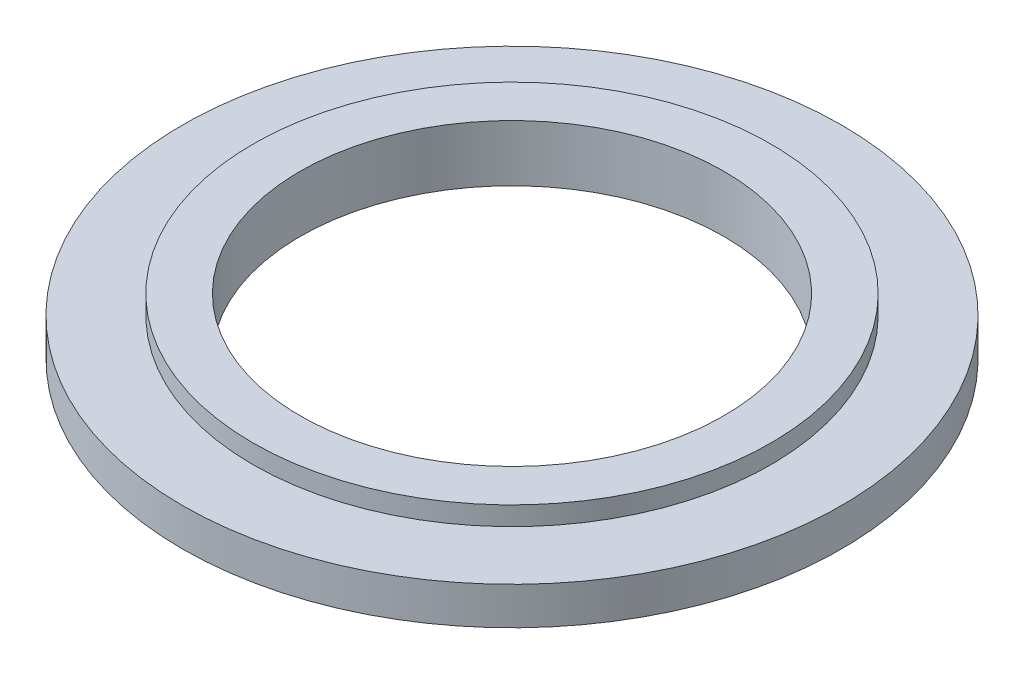
ISO-10303-21;
HEADER;
FILE_DESCRIPTION(('STEP AP214'),'2;1');
FILE_NAME('part.step','',(''),(''),'','','');
FILE_SCHEMA(('AUTOMOTIVE_DESIGN { 1 0 10303 214 1 1 1 1 }'));
ENDSEC;
DATA;
#1=APPLICATION_CONTEXT('core data for automotive mechanical design processes');
#2=APPLICATION_PROTOCOL_DEFINITION('international standard','automotive_design',2000,#1);
#3=PRODUCT_CONTEXT('',#1,'mechanical');
#4=PRODUCT('Part','Part','',(#3));
#5=PRODUCT_RELATED_PRODUCT_CATEGORY('part','',(#4));
#6=PRODUCT_DEFINITION_FORMATION('','',#4);
#7=PRODUCT_DEFINITION_CONTEXT('part definition',#1,'design');
#8=PRODUCT_DEFINITION('design','',#6,#7);
#9=PRODUCT_DEFINITION_SHAPE('','',#8);
#10=(LENGTH_UNIT() NAMED_UNIT(*) SI_UNIT(.MILLI.,.METRE.));
#11=(NAMED_UNIT(*) PLANE_ANGLE_UNIT() SI_UNIT($,.RADIAN.));
#12=(NAMED_UNIT(*) SI_UNIT($,.STERADIAN.) SOLID_ANGLE_UNIT());
#13=UNCERTAINTY_MEASURE_WITH_UNIT(LENGTH_MEASURE(1.E-05),#10,'distance_accuracy_value','');
#14=(GEOMETRIC_REPRESENTATION_CONTEXT(3) GLOBAL_UNCERTAINTY_ASSIGNED_CONTEXT((#13)) GLOBAL_UNIT_ASSIGNED_CONTEXT((#10,
#11,#12)) REPRESENTATION_CONTEXT('',''));
#15=CARTESIAN_POINT('',(0.,0.,0.));
#16=DIRECTION('',(0.,0.,1.));
#17=DIRECTION('',(1.,0.,0.));
#18=AXIS2_PLACEMENT_3D('',#15,#16,#17);
#19=CARTESIAN_POINT('',(0.,8.,0.));
#20=DIRECTION('',(0.,1.,0.));
#21=DIRECTION('',(0.,0.,1.));
#22=AXIS2_PLACEMENT_3D('',#19,#20,#21);
#23=CYLINDRICAL_SURFACE('',#22,55.);
#24=CARTESIAN_POINT('',(0.,8.,0.));
#25=DIRECTION('',(0.,1.,0.));
#26=DIRECTION('',(0.,0.,1.));
#27=AXIS2_PLACEMENT_3D('',#24,#25,#26);
#28=CIRCLE('',#27,55.);
#29=CARTESIAN_POINT('',(0.,8.,55.));
#30=VERTEX_POINT('',#29);
#31=EDGE_CURVE('E33',#30,#30,#28,.F.);
#32=ORIENTED_EDGE('',*,*,#31,.F.);
#33=EDGE_LOOP('',(#32));
#34=FACE_BOUND('',#33,.T.);
#35=CARTESIAN_POINT('',(0.,12.,0.));
#36=DIRECTION('',(0.,1.,0.));
#37=DIRECTION('',(0.,0.,1.));
#38=AXIS2_PLACEMENT_3D('',#35,#36,#37);
#39=CIRCLE('',#38,55.);
#40=CARTESIAN_POINT('',(0.,12.,55.));
#41=VERTEX_POINT('',#40);
#42=EDGE_CURVE('E17',#41,#41,#39,.T.);
#43=ORIENTED_EDGE('',*,*,#42,.F.);
#44=EDGE_LOOP('',(#43));
#45=FACE_BOUND('',#44,.T.);
#46=ADVANCED_FACE('F14',(#34,#45),#23,.T.);
#47=CARTESIAN_POINT('',(0.,12.,0.));
#48=DIRECTION('',(0.,1.,0.));
#49=DIRECTION('',(0.,0.,1.));
#50=AXIS2_PLACEMENT_3D('',#47,#48,#49);
#51=PLANE('',#50);
#52=ORIENTED_EDGE('',*,*,#42,.T.);
#53=EDGE_LOOP('',(#52));
#54=FACE_BOUND('',#53,.T.);
#55=CARTESIAN_POINT('',(0.,12.,0.));
#56=DIRECTION('',(0.,-1.,0.));
#57=DIRECTION('',(0.,0.,-1.));
#58=AXIS2_PLACEMENT_3D('',#55,#56,#57);
#59=CIRCLE('',#58,45.);
#60=CARTESIAN_POINT('',(0.,12.,-45.));
#61=VERTEX_POINT('',#60);
#62=EDGE_CURVE('E31',#61,#61,#59,.T.);
#63=ORIENTED_EDGE('',*,*,#62,.T.);
#64=EDGE_LOOP('',(#63));
#65=FACE_BOUND('',#64,.T.);
#66=ADVANCED_FACE('F40',(#54,#65),#51,.T.);
#67=CARTESIAN_POINT('',(0.,8.,0.));
#68=DIRECTION('',(0.,1.,0.));
#69=DIRECTION('',(0.,0.,1.));
#70=AXIS2_PLACEMENT_3D('',#67,#68,#69);
#71=PLANE('',#70);
#72=CARTESIAN_POINT('',(0.,8.,0.));
#73=DIRECTION('',(0.,-1.,0.));
#74=DIRECTION('',(0.,0.,-1.));
#75=AXIS2_PLACEMENT_3D('',#72,#73,#74);
#76=CIRCLE('',#75,70.);
#77=CARTESIAN_POINT('',(0.,8.,-70.));
#78=VERTEX_POINT('',#77);
#79=EDGE_CURVE('E26',#78,#78,#76,.T.);
#80=ORIENTED_EDGE('',*,*,#79,.F.);
#81=EDGE_LOOP('',(#80));
#82=FACE_BOUND('',#81,.T.);
#83=ORIENTED_EDGE('',*,*,#31,.T.);
#84=EDGE_LOOP('',(#83));
#85=FACE_BOUND('',#84,.T.);
#86=ADVANCED_FACE('F50',(#82,#85),#71,.T.);
#87=CARTESIAN_POINT('',(0.,12.,0.));
#88=DIRECTION('',(0.,-1.,0.));
#89=DIRECTION('',(0.,0.,-1.));
#90=AXIS2_PLACEMENT_3D('',#87,#88,#89);
#91=CYLINDRICAL_SURFACE('',#90,45.);
#92=ORIENTED_EDGE('',*,*,#62,.F.);
#93=EDGE_LOOP('',(#92));
#94=FACE_BOUND('',#93,.T.);
#95=CARTESIAN_POINT('',(0.,0.,0.));
#96=DIRECTION('',(0.,-1.,0.));
#97=DIRECTION('',(0.,0.,-1.));
#98=AXIS2_PLACEMENT_3D('',#95,#96,#97);
#99=CIRCLE('',#98,45.);
#100=CARTESIAN_POINT('',(0.,0.,-45.));
#101=VERTEX_POINT('',#100);
#102=EDGE_CURVE('E21',#101,#101,#99,.T.);
#103=ORIENTED_EDGE('',*,*,#102,.T.);
#104=EDGE_LOOP('',(#103));
#105=FACE_BOUND('',#104,.T.);
#106=ADVANCED_FACE('F60',(#94,#105),#91,.F.);
#107=CARTESIAN_POINT('',(0.,12.,0.));
#108=DIRECTION('',(0.,-1.,0.));
#109=DIRECTION('',(0.,0.,-1.));
#110=AXIS2_PLACEMENT_3D('',#107,#108,#109);
#111=CYLINDRICAL_SURFACE('',#110,70.);
#112=ORIENTED_EDGE('',*,*,#79,.T.);
#113=EDGE_LOOP('',(#112));
#114=FACE_BOUND('',#113,.T.);
#115=CARTESIAN_POINT('',(0.,0.,0.));
#116=DIRECTION('',(0.,-1.,0.));
#117=DIRECTION('',(0.,0.,-1.));
#118=AXIS2_PLACEMENT_3D('',#115,#116,#117);
#119=CIRCLE('',#118,70.);
#120=CARTESIAN_POINT('',(0.,0.,-70.));
#121=VERTEX_POINT('',#120);
#122=EDGE_CURVE('E10',#121,#121,#119,.F.);
#123=ORIENTED_EDGE('',*,*,#122,.T.);
#124=EDGE_LOOP('',(#123));
#125=FACE_BOUND('',#124,.T.);
#126=ADVANCED_FACE('F53',(#114,#125),#111,.T.);
#127=CARTESIAN_POINT('',(0.,0.,0.));
#128=DIRECTION('',(0.,1.,0.));
#129=DIRECTION('',(0.,0.,1.));
#130=AXIS2_PLACEMENT_3D('',#127,#128,#129);
#131=PLANE('',#130);
#132=ORIENTED_EDGE('',*,*,#122,.F.);
#133=EDGE_LOOP('',(#132));
#134=FACE_BOUND('',#133,.T.);
#135=ORIENTED_EDGE('',*,*,#102,.F.);
#136=EDGE_LOOP('',(#135));
#137=FACE_BOUND('',#136,.T.);
#138=ADVANCED_FACE('F51',(#134,#137),#131,.F.);
#139=CLOSED_SHELL('',(#46,#66,#86,#106,#126,#138));
#140=MANIFOLD_SOLID_BREP('B1',#139);
#141=ADVANCED_BREP_SHAPE_REPRESENTATION('',(#18,#140),#14);
#142=SHAPE_DEFINITION_REPRESENTATION(#9,#141);
ENDSEC;
END-ISO-10303-21;
